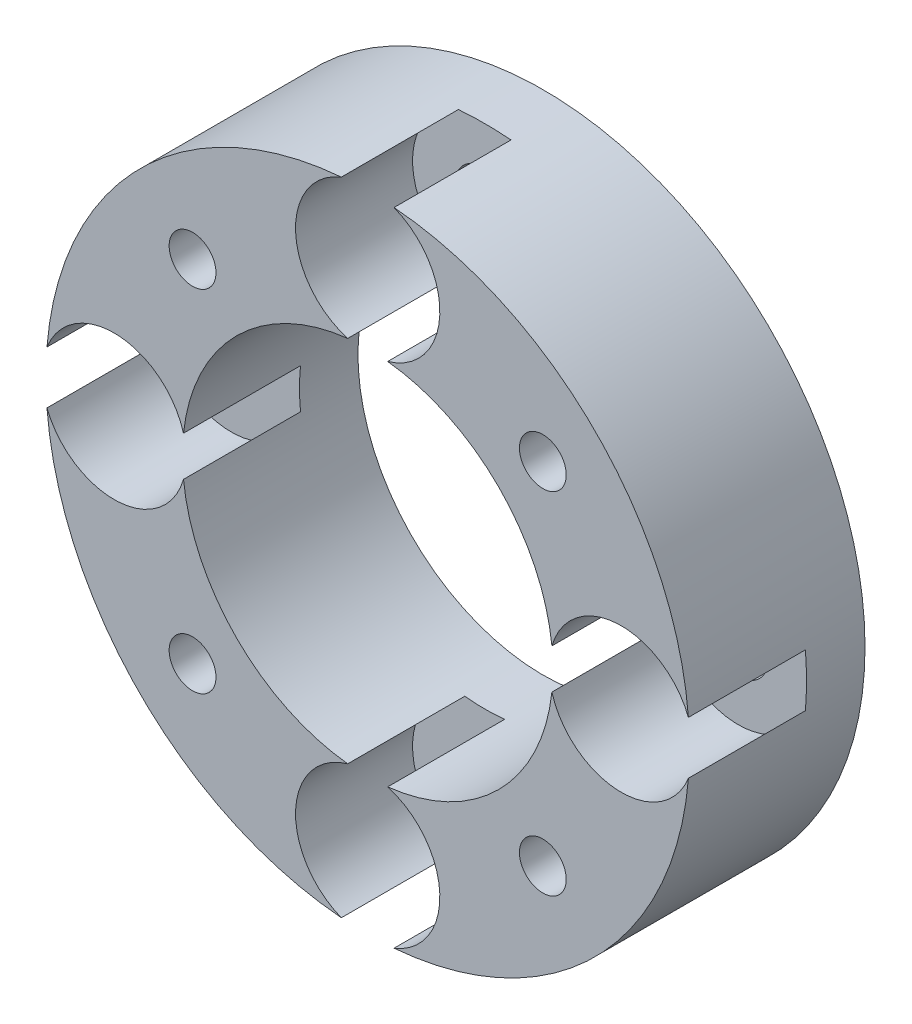
ISO-10303-21;
HEADER;
FILE_DESCRIPTION(('STEP AP214'),'2;1');
FILE_NAME('part.step','',(''),(''),'','','');
FILE_SCHEMA(('AUTOMOTIVE_DESIGN { 1 0 10303 214 1 1 1 1 }'));
ENDSEC;
DATA;
#1=APPLICATION_CONTEXT('core data for automotive mechanical design processes');
#2=APPLICATION_PROTOCOL_DEFINITION('international standard','automotive_design',2000,#1);
#3=PRODUCT_CONTEXT('',#1,'mechanical');
#4=PRODUCT('Part','Part','',(#3));
#5=PRODUCT_RELATED_PRODUCT_CATEGORY('part','',(#4));
#6=PRODUCT_DEFINITION_FORMATION('','',#4);
#7=PRODUCT_DEFINITION_CONTEXT('part definition',#1,'design');
#8=PRODUCT_DEFINITION('design','',#6,#7);
#9=PRODUCT_DEFINITION_SHAPE('','',#8);
#10=(LENGTH_UNIT() NAMED_UNIT(*) SI_UNIT(.MILLI.,.METRE.));
#11=(NAMED_UNIT(*) PLANE_ANGLE_UNIT() SI_UNIT($,.RADIAN.));
#12=(NAMED_UNIT(*) SI_UNIT($,.STERADIAN.) SOLID_ANGLE_UNIT());
#13=UNCERTAINTY_MEASURE_WITH_UNIT(LENGTH_MEASURE(1.E-05),#10,'distance_accuracy_value','');
#14=(GEOMETRIC_REPRESENTATION_CONTEXT(3) GLOBAL_UNCERTAINTY_ASSIGNED_CONTEXT((#13)) GLOBAL_UNIT_ASSIGNED_CONTEXT((#10,
#11,#12)) REPRESENTATION_CONTEXT('',''));
#15=CARTESIAN_POINT('',(0.,0.,0.));
#16=DIRECTION('',(0.,0.,1.));
#17=DIRECTION('',(1.,0.,0.));
#18=AXIS2_PLACEMENT_3D('',#15,#16,#17);
#19=CARTESIAN_POINT('',(0.,0.,9.));
#20=DIRECTION('',(0.,0.,1.));
#21=DIRECTION('',(1.,0.,0.));
#22=AXIS2_PLACEMENT_3D('',#19,#20,#21);
#23=PLANE('',#22);
#24=CARTESIAN_POINT('',(0.,13.,9.));
#25=DIRECTION('',(0.,0.,1.));
#26=DIRECTION('',(1.,0.,0.));
#27=AXIS2_PLACEMENT_3D('',#24,#25,#26);
#28=CIRCLE('',#27,3.7);
#29=CARTESIAN_POINT('',(-1.35078675299656,16.4446153846154,9.));
#30=VERTEX_POINT('',#29);
#31=CARTESIAN_POINT('',(-1.02432428297214,9.44461538461539,9.));
#32=VERTEX_POINT('',#31);
#33=EDGE_CURVE('E233',#30,#32,#28,.T.);
#34=ORIENTED_EDGE('',*,*,#33,.F.);
#35=CARTESIAN_POINT('',(0.,0.,9.));
#36=DIRECTION('',(0.,0.,1.));
#37=DIRECTION('',(1.,0.,0.));
#38=AXIS2_PLACEMENT_3D('',#35,#36,#37);
#39=CIRCLE('',#38,16.5);
#40=CARTESIAN_POINT('',(-16.4446153846155,1.3507867529949,9.));
#41=VERTEX_POINT('',#40);
#42=EDGE_CURVE('E166',#30,#41,#39,.T.);
#43=ORIENTED_EDGE('',*,*,#42,.T.);
#44=CARTESIAN_POINT('',(-12.9999999999996,-3.69482222595252E-13,9.));
#45=DIRECTION('',(0.,0.,1.));
#46=DIRECTION('',(1.,0.,0.));
#47=AXIS2_PLACEMENT_3D('',#44,#45,#46);
#48=CIRCLE('',#47,3.7);
#49=CARTESIAN_POINT('',(-9.44461538461531,1.0243242829728,9.));
#50=VERTEX_POINT('',#49);
#51=EDGE_CURVE('E149',#50,#41,#48,.T.);
#52=ORIENTED_EDGE('',*,*,#51,.F.);
#53=CARTESIAN_POINT('',(0.,0.,9.));
#54=DIRECTION('',(0.,0.,1.));
#55=DIRECTION('',(1.,0.,0.));
#56=AXIS2_PLACEMENT_3D('',#53,#54,#55);
#57=CIRCLE('',#56,9.5);
#58=EDGE_CURVE('E164',#32,#50,#57,.T.);
#59=ORIENTED_EDGE('',*,*,#58,.F.);
#60=EDGE_LOOP('',(#34,#43,#52,#59));
#61=FACE_BOUND('',#60,.T.);
#62=CARTESIAN_POINT('',(-8.98025612106916,8.98025612106865,9.));
#63=DIRECTION('',(0.,0.,1.));
#64=DIRECTION('',(1.,0.,0.));
#65=AXIS2_PLACEMENT_3D('',#62,#63,#64);
#66=CIRCLE('',#65,1.20000000000053);
#67=CARTESIAN_POINT('',(-7.78025612106863,8.98025612106865,9.));
#68=VERTEX_POINT('',#67);
#69=EDGE_CURVE('E277',#68,#68,#66,.T.);
#70=ORIENTED_EDGE('',*,*,#69,.F.);
#71=EDGE_LOOP('',(#70));
#72=FACE_BOUND('',#71,.T.);
#73=ADVANCED_FACE('F34',(#61,#72),#23,.T.);
#74=CARTESIAN_POINT('',(1.02432428297214,9.44461538461539,9.));
#75=VERTEX_POINT('',#74);
#76=CARTESIAN_POINT('',(1.35078675299656,16.4446153846154,9.));
#77=VERTEX_POINT('',#76);
#78=EDGE_CURVE('E399',#75,#77,#28,.T.);
#79=ORIENTED_EDGE('',*,*,#78,.F.);
#80=CARTESIAN_POINT('',(9.44461538461545,1.02432428297149,9.));
#81=VERTEX_POINT('',#80);
#82=EDGE_CURVE('E175',#81,#75,#57,.T.);
#83=ORIENTED_EDGE('',*,*,#82,.F.);
#84=CARTESIAN_POINT('',(13.0000000000004,3.6789018175636E-13,9.));
#85=DIRECTION('',(0.,0.,1.));
#86=DIRECTION('',(1.,0.,0.));
#87=AXIS2_PLACEMENT_3D('',#84,#85,#86);
#88=CIRCLE('',#87,3.7);
#89=CARTESIAN_POINT('',(16.4446153846153,1.35078675299822,9.));
#90=VERTEX_POINT('',#89);
#91=EDGE_CURVE('E397',#90,#81,#88,.T.);
#92=ORIENTED_EDGE('',*,*,#91,.F.);
#93=EDGE_CURVE('E196',#90,#77,#39,.T.);
#94=ORIENTED_EDGE('',*,*,#93,.T.);
#95=EDGE_LOOP('',(#79,#83,#92,#94));
#96=FACE_BOUND('',#95,.T.);
#97=CARTESIAN_POINT('',(8.98025612106914,8.98025612106917,9.));
#98=DIRECTION('',(0.,0.,1.));
#99=DIRECTION('',(1.,0.,0.));
#100=AXIS2_PLACEMENT_3D('',#97,#98,#99);
#101=CIRCLE('',#100,1.2);
#102=CARTESIAN_POINT('',(10.1802561210691,8.98025612106917,9.));
#103=VERTEX_POINT('',#102);
#104=EDGE_CURVE('E190',#103,#103,#101,.T.);
#105=ORIENTED_EDGE('',*,*,#104,.F.);
#106=EDGE_LOOP('',(#105));
#107=FACE_BOUND('',#106,.T.);
#108=ADVANCED_FACE('F310',(#96,#107),#23,.T.);
#109=CARTESIAN_POINT('',(7.35780363512721E-13,-13.,9.));
#110=DIRECTION('',(0.,0.,1.));
#111=DIRECTION('',(1.,0.,0.));
#112=AXIS2_PLACEMENT_3D('',#109,#110,#111);
#113=CIRCLE('',#112,3.7);
#114=CARTESIAN_POINT('',(-1.02432428297161,-9.44461538461544,9.));
#115=VERTEX_POINT('',#114);
#116=CARTESIAN_POINT('',(-1.35078675299563,-16.4446153846155,9.));
#117=VERTEX_POINT('',#116);
#118=EDGE_CURVE('E345',#115,#117,#113,.T.);
#119=ORIENTED_EDGE('',*,*,#118,.F.);
#120=CARTESIAN_POINT('',(-9.44461538461525,-1.02432428297334,9.));
#121=VERTEX_POINT('',#120);
#122=EDGE_CURVE('E176',#121,#115,#57,.T.);
#123=ORIENTED_EDGE('',*,*,#122,.F.);
#124=CARTESIAN_POINT('',(-16.4446153846154,-1.35078675299584,9.));
#125=VERTEX_POINT('',#124);
#126=EDGE_CURVE('E168',#125,#121,#48,.T.);
#127=ORIENTED_EDGE('',*,*,#126,.F.);
#128=EDGE_CURVE('E379',#125,#117,#39,.T.);
#129=ORIENTED_EDGE('',*,*,#128,.T.);
#130=EDGE_LOOP('',(#119,#123,#127,#129));
#131=FACE_BOUND('',#130,.T.);
#132=CARTESIAN_POINT('',(-8.98025612106865,-8.98025612106965,9.));
#133=DIRECTION('',(0.,0.,1.));
#134=DIRECTION('',(1.,0.,0.));
#135=AXIS2_PLACEMENT_3D('',#132,#133,#134);
#136=CIRCLE('',#135,1.20000000000036);
#137=CARTESIAN_POINT('',(-7.78025612106829,-8.98025612106965,9.));
#138=VERTEX_POINT('',#137);
#139=EDGE_CURVE('E283',#138,#138,#136,.T.);
#140=ORIENTED_EDGE('',*,*,#139,.F.);
#141=EDGE_LOOP('',(#140));
#142=FACE_BOUND('',#141,.T.);
#143=ADVANCED_FACE('F316',(#131,#142),#23,.T.);
#144=CARTESIAN_POINT('',(0.,13.,9.));
#145=DIRECTION('',(0.,0.,-1.));
#146=DIRECTION('',(-1.,0.,0.));
#147=AXIS2_PLACEMENT_3D('',#144,#145,#146);
#148=CYLINDRICAL_SURFACE('',#147,1.55);
#149=CARTESIAN_POINT('',(0.,13.,0.));
#150=DIRECTION('',(0.,0.,1.));
#151=DIRECTION('',(1.,0.,0.));
#152=AXIS2_PLACEMENT_3D('',#149,#150,#151);
#153=CIRCLE('',#152,1.55);
#154=CARTESIAN_POINT('',(1.55,13.,0.));
#155=VERTEX_POINT('',#154);
#156=EDGE_CURVE('E273',#155,#155,#153,.T.);
#157=ORIENTED_EDGE('',*,*,#156,.F.);
#158=EDGE_LOOP('',(#157));
#159=FACE_BOUND('',#158,.T.);
#160=CARTESIAN_POINT('',(0.,13.,3.));
#161=DIRECTION('',(0.,0.,1.));
#162=DIRECTION('',(1.,0.,0.));
#163=AXIS2_PLACEMENT_3D('',#160,#161,#162);
#164=CIRCLE('',#163,1.55);
#165=CARTESIAN_POINT('',(1.55,13.,3.));
#166=VERTEX_POINT('',#165);
#167=EDGE_CURVE('E216',#166,#166,#164,.T.);
#168=ORIENTED_EDGE('',*,*,#167,.T.);
#169=EDGE_LOOP('',(#168));
#170=FACE_BOUND('',#169,.T.);
#171=ADVANCED_FACE('F333',(#159,#170),#148,.F.);
#172=CARTESIAN_POINT('',(13.0000000000003,3.39652169345829E-13,9.));
#173=DIRECTION('',(0.,0.,-1.));
#174=DIRECTION('',(-1.,0.,0.));
#175=AXIS2_PLACEMENT_3D('',#172,#173,#174);
#176=CYLINDRICAL_SURFACE('',#175,1.55);
#177=CARTESIAN_POINT('',(13.0000000000003,3.39652169345829E-13,0.));
#178=DIRECTION('',(0.,0.,1.));
#179=DIRECTION('',(1.,0.,0.));
#180=AXIS2_PLACEMENT_3D('',#177,#178,#179);
#181=CIRCLE('',#180,1.55);
#182=CARTESIAN_POINT('',(14.5500000000003,3.39652169345829E-13,0.));
#183=VERTEX_POINT('',#182);
#184=EDGE_CURVE('E270',#183,#183,#181,.T.);
#185=ORIENTED_EDGE('',*,*,#184,.F.);
#186=EDGE_LOOP('',(#185));
#187=FACE_BOUND('',#186,.T.);
#188=CARTESIAN_POINT('',(13.0000000000003,3.39652169345829E-13,3.));
#189=DIRECTION('',(0.,0.,1.));
#190=DIRECTION('',(1.,0.,0.));
#191=AXIS2_PLACEMENT_3D('',#188,#189,#190);
#192=CIRCLE('',#191,1.55);
#193=CARTESIAN_POINT('',(14.5500000000003,3.39652169345829E-13,3.));
#194=VERTEX_POINT('',#193);
#195=EDGE_CURVE('E211',#194,#194,#192,.T.);
#196=ORIENTED_EDGE('',*,*,#195,.T.);
#197=EDGE_LOOP('',(#196));
#198=FACE_BOUND('',#197,.T.);
#199=ADVANCED_FACE('F338',(#187,#198),#176,.F.);
#200=CARTESIAN_POINT('',(6.79304338691657E-13,-13.,9.));
#201=DIRECTION('',(0.,0.,-1.));
#202=DIRECTION('',(-1.,0.,0.));
#203=AXIS2_PLACEMENT_3D('',#200,#201,#202);
#204=CYLINDRICAL_SURFACE('',#203,1.55);
#205=CARTESIAN_POINT('',(6.79304338691657E-13,-13.,0.));
#206=DIRECTION('',(0.,0.,1.));
#207=DIRECTION('',(1.,0.,0.));
#208=AXIS2_PLACEMENT_3D('',#205,#206,#207);
#209=CIRCLE('',#208,1.55);
#210=CARTESIAN_POINT('',(1.55000000000068,-13.,0.));
#211=VERTEX_POINT('',#210);
#212=EDGE_CURVE('E267',#211,#211,#209,.T.);
#213=ORIENTED_EDGE('',*,*,#212,.F.);
#214=EDGE_LOOP('',(#213));
#215=FACE_BOUND('',#214,.T.);
#216=CARTESIAN_POINT('',(6.79304338691657E-13,-13.,3.));
#217=DIRECTION('',(0.,0.,1.));
#218=DIRECTION('',(1.,0.,0.));
#219=AXIS2_PLACEMENT_3D('',#216,#217,#218);
#220=CIRCLE('',#219,1.55);
#221=CARTESIAN_POINT('',(1.55000000000068,-13.,3.));
#222=VERTEX_POINT('',#221);
#223=EDGE_CURVE('E206',#222,#222,#220,.T.);
#224=ORIENTED_EDGE('',*,*,#223,.T.);
#225=EDGE_LOOP('',(#224));
#226=FACE_BOUND('',#225,.T.);
#227=ADVANCED_FACE('F327',(#215,#226),#204,.F.);
#228=CARTESIAN_POINT('',(-12.9999999999997,-3.4124421018472E-13,9.));
#229=DIRECTION('',(0.,0.,-1.));
#230=DIRECTION('',(-1.,0.,0.));
#231=AXIS2_PLACEMENT_3D('',#228,#229,#230);
#232=CYLINDRICAL_SURFACE('',#231,1.55);
#233=CARTESIAN_POINT('',(-12.9999999999997,-3.4124421018472E-13,0.));
#234=DIRECTION('',(0.,0.,1.));
#235=DIRECTION('',(1.,0.,0.));
#236=AXIS2_PLACEMENT_3D('',#233,#234,#235);
#237=CIRCLE('',#236,1.55);
#238=CARTESIAN_POINT('',(-11.4499999999997,-3.4124421018472E-13,0.));
#239=VERTEX_POINT('',#238);
#240=EDGE_CURVE('E264',#239,#239,#237,.T.);
#241=ORIENTED_EDGE('',*,*,#240,.F.);
#242=EDGE_LOOP('',(#241));
#243=FACE_BOUND('',#242,.T.);
#244=CARTESIAN_POINT('',(-12.9999999999997,-3.4124421018472E-13,3.));
#245=DIRECTION('',(0.,0.,1.));
#246=DIRECTION('',(1.,0.,0.));
#247=AXIS2_PLACEMENT_3D('',#244,#245,#246);
#248=CIRCLE('',#247,1.55);
#249=CARTESIAN_POINT('',(-11.4499999999997,-3.4124421018472E-13,3.));
#250=VERTEX_POINT('',#249);
#251=EDGE_CURVE('E202',#250,#250,#248,.T.);
#252=ORIENTED_EDGE('',*,*,#251,.T.);
#253=EDGE_LOOP('',(#252));
#254=FACE_BOUND('',#253,.T.);
#255=ADVANCED_FACE('F320',(#243,#254),#232,.F.);
#256=CARTESIAN_POINT('',(9.44461538461551,-1.02432428297096,9.));
#257=VERTEX_POINT('',#256);
#258=CARTESIAN_POINT('',(16.4446153846153,-1.35078675299729,9.));
#259=VERTEX_POINT('',#258);
#260=EDGE_CURVE('E385',#257,#259,#88,.T.);
#261=ORIENTED_EDGE('',*,*,#260,.F.);
#262=CARTESIAN_POINT('',(1.02432428297268,-9.44461538461533,9.));
#263=VERTEX_POINT('',#262);
#264=EDGE_CURVE('E180',#263,#257,#57,.T.);
#265=ORIENTED_EDGE('',*,*,#264,.F.);
#266=CARTESIAN_POINT('',(1.35078675299749,-16.4446153846153,9.));
#267=VERTEX_POINT('',#266);
#268=EDGE_CURVE('E387',#267,#263,#113,.T.);
#269=ORIENTED_EDGE('',*,*,#268,.F.);
#270=EDGE_CURVE('E199',#267,#259,#39,.T.);
#271=ORIENTED_EDGE('',*,*,#270,.T.);
#272=EDGE_LOOP('',(#261,#265,#269,#271));
#273=FACE_BOUND('',#272,.T.);
#274=CARTESIAN_POINT('',(8.98025612106965,-8.98025612106916,9.));
#275=DIRECTION('',(0.,0.,1.));
#276=DIRECTION('',(1.,0.,0.));
#277=AXIS2_PLACEMENT_3D('',#274,#275,#276);
#278=CIRCLE('',#277,1.19999999999986);
#279=CARTESIAN_POINT('',(10.1802561210695,-8.98025612106916,9.));
#280=VERTEX_POINT('',#279);
#281=EDGE_CURVE('E189',#280,#280,#278,.T.);
#282=ORIENTED_EDGE('',*,*,#281,.F.);
#283=EDGE_LOOP('',(#282));
#284=FACE_BOUND('',#283,.T.);
#285=ADVANCED_FACE('F312',(#273,#284),#23,.T.);
#286=CARTESIAN_POINT('',(0.,0.,0.));
#287=DIRECTION('',(0.,0.,1.));
#288=DIRECTION('',(1.,0.,0.));
#289=AXIS2_PLACEMENT_3D('',#286,#287,#288);
#290=PLANE('',#289);
#291=CARTESIAN_POINT('',(0.,0.,0.));
#292=DIRECTION('',(0.,0.,1.));
#293=DIRECTION('',(1.,0.,0.));
#294=AXIS2_PLACEMENT_3D('',#291,#292,#293);
#295=CIRCLE('',#294,16.5);
#296=CARTESIAN_POINT('',(16.5,0.,0.));
#297=VERTEX_POINT('',#296);
#298=EDGE_CURVE('E193',#297,#297,#295,.T.);
#299=ORIENTED_EDGE('',*,*,#298,.F.);
#300=EDGE_LOOP('',(#299));
#301=FACE_BOUND('',#300,.T.);
#302=CARTESIAN_POINT('',(8.98025612106914,8.98025612106917,0.));
#303=DIRECTION('',(0.,0.,1.));
#304=DIRECTION('',(1.,0.,0.));
#305=AXIS2_PLACEMENT_3D('',#302,#303,#304);
#306=CIRCLE('',#305,1.2);
#307=CARTESIAN_POINT('',(10.1802561210691,8.98025612106917,0.));
#308=VERTEX_POINT('',#307);
#309=EDGE_CURVE('E179',#308,#308,#306,.T.);
#310=ORIENTED_EDGE('',*,*,#309,.T.);
#311=EDGE_LOOP('',(#310));
#312=FACE_BOUND('',#311,.T.);
#313=CARTESIAN_POINT('',(0.,0.,0.));
#314=DIRECTION('',(0.,0.,1.));
#315=DIRECTION('',(1.,0.,0.));
#316=AXIS2_PLACEMENT_3D('',#313,#314,#315);
#317=CIRCLE('',#316,9.5);
#318=CARTESIAN_POINT('',(9.5,0.,0.));
#319=VERTEX_POINT('',#318);
#320=EDGE_CURVE('E186',#319,#319,#317,.T.);
#321=ORIENTED_EDGE('',*,*,#320,.T.);
#322=EDGE_LOOP('',(#321));
#323=FACE_BOUND('',#322,.T.);
#324=CARTESIAN_POINT('',(8.98025612106965,-8.98025612106916,0.));
#325=DIRECTION('',(0.,0.,1.));
#326=DIRECTION('',(1.,0.,0.));
#327=AXIS2_PLACEMENT_3D('',#324,#325,#326);
#328=CIRCLE('',#327,1.19999999999986);
#329=CARTESIAN_POINT('',(10.1802561210695,-8.98025612106916,0.));
#330=VERTEX_POINT('',#329);
#331=EDGE_CURVE('E184',#330,#330,#328,.T.);
#332=ORIENTED_EDGE('',*,*,#331,.T.);
#333=EDGE_LOOP('',(#332));
#334=FACE_BOUND('',#333,.T.);
#335=CARTESIAN_POINT('',(-8.98025612106865,-8.98025612106965,0.));
#336=DIRECTION('',(0.,0.,1.));
#337=DIRECTION('',(1.,0.,0.));
#338=AXIS2_PLACEMENT_3D('',#335,#336,#337);
#339=CIRCLE('',#338,1.20000000000036);
#340=CARTESIAN_POINT('',(-7.78025612106829,-8.98025612106965,0.));
#341=VERTEX_POINT('',#340);
#342=EDGE_CURVE('E280',#341,#341,#339,.T.);
#343=ORIENTED_EDGE('',*,*,#342,.T.);
#344=EDGE_LOOP('',(#343));
#345=FACE_BOUND('',#344,.T.);
#346=CARTESIAN_POINT('',(-8.98025612106916,8.98025612106865,0.));
#347=DIRECTION('',(0.,0.,1.));
#348=DIRECTION('',(1.,0.,0.));
#349=AXIS2_PLACEMENT_3D('',#346,#347,#348);
#350=CIRCLE('',#349,1.20000000000053);
#351=CARTESIAN_POINT('',(-7.78025612106863,8.98025612106865,0.));
#352=VERTEX_POINT('',#351);
#353=EDGE_CURVE('E276',#352,#352,#350,.T.);
#354=ORIENTED_EDGE('',*,*,#353,.T.);
#355=EDGE_LOOP('',(#354));
#356=FACE_BOUND('',#355,.T.);
#357=ORIENTED_EDGE('',*,*,#156,.T.);
#358=EDGE_LOOP('',(#357));
#359=FACE_BOUND('',#358,.T.);
#360=ORIENTED_EDGE('',*,*,#184,.T.);
#361=EDGE_LOOP('',(#360));
#362=FACE_BOUND('',#361,.T.);
#363=ORIENTED_EDGE('',*,*,#212,.T.);
#364=EDGE_LOOP('',(#363));
#365=FACE_BOUND('',#364,.T.);
#366=ORIENTED_EDGE('',*,*,#240,.T.);
#367=EDGE_LOOP('',(#366));
#368=FACE_BOUND('',#367,.T.);
#369=ADVANCED_FACE('F293',(#301,#312,#323,#334,#345,#356,#359,#362,#365,#368),#290,.F.);
#370=CARTESIAN_POINT('',(0.,0.,9.));
#371=DIRECTION('',(0.,0.,-1.));
#372=DIRECTION('',(-1.,0.,0.));
#373=AXIS2_PLACEMENT_3D('',#370,#371,#372);
#374=CYLINDRICAL_SURFACE('',#373,16.5);
#375=CARTESIAN_POINT('',(0.,0.,3.));
#376=DIRECTION('',(0.,0.,1.));
#377=DIRECTION('',(1.,0.,0.));
#378=AXIS2_PLACEMENT_3D('',#375,#376,#377);
#379=CIRCLE('',#378,16.5);
#380=CARTESIAN_POINT('',(1.35078675299656,16.4446153846154,3.));
#381=VERTEX_POINT('',#380);
#382=CARTESIAN_POINT('',(-1.35078675299656,16.4446153846154,3.));
#383=VERTEX_POINT('',#382);
#384=EDGE_CURVE('E236',#381,#383,#379,.T.);
#385=ORIENTED_EDGE('',*,*,#384,.F.);
#386=DIRECTION('',(0.,0.,1.));
#387=VECTOR('',#386,1.);
#388=CARTESIAN_POINT('',(1.35078675299655,16.4446153846154,6.));
#389=LINE('',#388,#387);
#390=EDGE_CURVE('E261',#381,#77,#389,.T.);
#391=ORIENTED_EDGE('',*,*,#390,.T.);
#392=ORIENTED_EDGE('',*,*,#93,.F.);
#393=DIRECTION('',(0.,0.,1.));
#394=VECTOR('',#393,1.);
#395=CARTESIAN_POINT('',(16.4446153846152,1.35078675299823,6.));
#396=LINE('',#395,#394);
#397=CARTESIAN_POINT('',(16.4446153846153,1.35078675299822,3.));
#398=VERTEX_POINT('',#397);
#399=EDGE_CURVE('E253',#90,#398,#396,.F.);
#400=ORIENTED_EDGE('',*,*,#399,.T.);
#401=CARTESIAN_POINT('',(0.,0.,3.));
#402=DIRECTION('',(0.,0.,1.));
#403=DIRECTION('',(1.,0.,0.));
#404=AXIS2_PLACEMENT_3D('',#401,#402,#403);
#405=CIRCLE('',#404,16.5);
#406=CARTESIAN_POINT('',(16.4446153846153,-1.35078675299729,3.));
#407=VERTEX_POINT('',#406);
#408=EDGE_CURVE('E220',#407,#398,#405,.T.);
#409=ORIENTED_EDGE('',*,*,#408,.F.);
#410=DIRECTION('',(0.,0.,1.));
#411=VECTOR('',#410,1.);
#412=CARTESIAN_POINT('',(16.4446153846153,-1.3507867529973,6.));
#413=LINE('',#412,#411);
#414=EDGE_CURVE('E256',#407,#259,#413,.T.);
#415=ORIENTED_EDGE('',*,*,#414,.T.);
#416=ORIENTED_EDGE('',*,*,#270,.F.);
#417=DIRECTION('',(0.,0.,1.));
#418=VECTOR('',#417,1.);
#419=CARTESIAN_POINT('',(1.35078675299748,-16.4446153846153,6.));
#420=LINE('',#419,#418);
#421=CARTESIAN_POINT('',(1.35078675299749,-16.4446153846153,3.));
#422=VERTEX_POINT('',#421);
#423=EDGE_CURVE('E247',#267,#422,#420,.F.);
#424=ORIENTED_EDGE('',*,*,#423,.T.);
#425=CARTESIAN_POINT('',(0.,0.,3.));
#426=DIRECTION('',(0.,0.,1.));
#427=DIRECTION('',(1.,0.,0.));
#428=AXIS2_PLACEMENT_3D('',#425,#426,#427);
#429=CIRCLE('',#428,16.5);
#430=CARTESIAN_POINT('',(-1.35078675299563,-16.4446153846155,3.));
#431=VERTEX_POINT('',#430);
#432=EDGE_CURVE('E215',#431,#422,#429,.T.);
#433=ORIENTED_EDGE('',*,*,#432,.F.);
#434=DIRECTION('',(0.,0.,1.));
#435=VECTOR('',#434,1.);
#436=CARTESIAN_POINT('',(-1.35078675299562,-16.4446153846155,6.));
#437=LINE('',#436,#435);
#438=EDGE_CURVE('E250',#431,#117,#437,.T.);
#439=ORIENTED_EDGE('',*,*,#438,.T.);
#440=ORIENTED_EDGE('',*,*,#128,.F.);
#441=DIRECTION('',(0.,0.,1.));
#442=VECTOR('',#441,1.);
#443=CARTESIAN_POINT('',(-16.4446153846154,-1.35078675299583,6.));
#444=LINE('',#443,#442);
#445=CARTESIAN_POINT('',(-16.4446153846154,-1.35078675299584,3.));
#446=VERTEX_POINT('',#445);
#447=EDGE_CURVE('E238',#125,#446,#444,.F.);
#448=ORIENTED_EDGE('',*,*,#447,.T.);
#449=CARTESIAN_POINT('',(0.,0.,3.));
#450=DIRECTION('',(0.,0.,1.));
#451=DIRECTION('',(1.,0.,0.));
#452=AXIS2_PLACEMENT_3D('',#449,#450,#451);
#453=CIRCLE('',#452,16.5);
#454=CARTESIAN_POINT('',(-16.4446153846155,1.3507867529949,3.));
#455=VERTEX_POINT('',#454);
#456=EDGE_CURVE('E210',#455,#446,#453,.T.);
#457=ORIENTED_EDGE('',*,*,#456,.F.);
#458=DIRECTION('',(0.,0.,1.));
#459=VECTOR('',#458,1.);
#460=CARTESIAN_POINT('',(-16.4446153846155,1.3507867529949,6.));
#461=LINE('',#460,#459);
#462=EDGE_CURVE('E245',#455,#41,#461,.T.);
#463=ORIENTED_EDGE('',*,*,#462,.T.);
#464=ORIENTED_EDGE('',*,*,#42,.F.);
#465=DIRECTION('',(0.,0.,1.));
#466=VECTOR('',#465,1.);
#467=CARTESIAN_POINT('',(-1.35078675299655,16.4446153846154,6.));
#468=LINE('',#467,#466);
#469=EDGE_CURVE('E259',#30,#383,#468,.F.);
#470=ORIENTED_EDGE('',*,*,#469,.T.);
#471=EDGE_LOOP('',(#385,#391,#392,#400,#409,#415,#416,#424,#433,#439,#440,#448,#457,#463,#464,#470));
#472=FACE_BOUND('',#471,.T.);
#473=ORIENTED_EDGE('',*,*,#298,.T.);
#474=EDGE_LOOP('',(#473));
#475=FACE_BOUND('',#474,.T.);
#476=ADVANCED_FACE('F36',(#472,#475),#374,.T.);
#477=CARTESIAN_POINT('',(8.98025612106914,8.98025612106917,9.));
#478=DIRECTION('',(0.,0.,-1.));
#479=DIRECTION('',(-1.,0.,0.));
#480=AXIS2_PLACEMENT_3D('',#477,#478,#479);
#481=CYLINDRICAL_SURFACE('',#480,1.2);
#482=ORIENTED_EDGE('',*,*,#104,.T.);
#483=EDGE_LOOP('',(#482));
#484=FACE_BOUND('',#483,.T.);
#485=ORIENTED_EDGE('',*,*,#309,.F.);
#486=EDGE_LOOP('',(#485));
#487=FACE_BOUND('',#486,.T.);
#488=ADVANCED_FACE('F307',(#484,#487),#481,.F.);
#489=CARTESIAN_POINT('',(0.,0.,9.));
#490=DIRECTION('',(0.,0.,-1.));
#491=DIRECTION('',(-1.,0.,0.));
#492=AXIS2_PLACEMENT_3D('',#489,#490,#491);
#493=CYLINDRICAL_SURFACE('',#492,9.5);
#494=DIRECTION('',(0.,0.,1.));
#495=VECTOR('',#494,1.);
#496=CARTESIAN_POINT('',(1.02432428297214,9.44461538461539,6.));
#497=LINE('',#496,#495);
#498=CARTESIAN_POINT('',(1.02432428297214,9.44461538461539,3.));
#499=VERTEX_POINT('',#498);
#500=EDGE_CURVE('E11',#499,#75,#497,.T.);
#501=ORIENTED_EDGE('',*,*,#500,.F.);
#502=CARTESIAN_POINT('',(0.,0.,3.));
#503=DIRECTION('',(0.,0.,1.));
#504=DIRECTION('',(1.,0.,0.));
#505=AXIS2_PLACEMENT_3D('',#502,#503,#504);
#506=CIRCLE('',#505,9.5);
#507=CARTESIAN_POINT('',(-1.02432428297214,9.44461538461539,3.));
#508=VERTEX_POINT('',#507);
#509=EDGE_CURVE('E219',#499,#508,#506,.T.);
#510=ORIENTED_EDGE('',*,*,#509,.T.);
#511=DIRECTION('',(0.,0.,1.));
#512=VECTOR('',#511,1.);
#513=CARTESIAN_POINT('',(-1.02432428297214,9.44461538461539,6.));
#514=LINE('',#513,#512);
#515=EDGE_CURVE('E42',#32,#508,#514,.F.);
#516=ORIENTED_EDGE('',*,*,#515,.F.);
#517=ORIENTED_EDGE('',*,*,#58,.T.);
#518=DIRECTION('',(0.,0.,1.));
#519=VECTOR('',#518,1.);
#520=CARTESIAN_POINT('',(-9.44461538461531,1.0243242829728,6.));
#521=LINE('',#520,#519);
#522=CARTESIAN_POINT('',(-9.44461538461531,1.0243242829728,3.));
#523=VERTEX_POINT('',#522);
#524=EDGE_CURVE('E146',#523,#50,#521,.T.);
#525=ORIENTED_EDGE('',*,*,#524,.F.);
#526=CARTESIAN_POINT('',(0.,0.,3.));
#527=DIRECTION('',(0.,0.,1.));
#528=DIRECTION('',(1.,0.,0.));
#529=AXIS2_PLACEMENT_3D('',#526,#527,#528);
#530=CIRCLE('',#529,9.5);
#531=CARTESIAN_POINT('',(-9.44461538461525,-1.02432428297334,3.));
#532=VERTEX_POINT('',#531);
#533=EDGE_CURVE('E205',#523,#532,#530,.T.);
#534=ORIENTED_EDGE('',*,*,#533,.T.);
#535=DIRECTION('',(0.,0.,1.));
#536=VECTOR('',#535,1.);
#537=CARTESIAN_POINT('',(-9.44461538461525,-1.02432428297334,6.));
#538=LINE('',#537,#536);
#539=EDGE_CURVE('E157',#121,#532,#538,.F.);
#540=ORIENTED_EDGE('',*,*,#539,.F.);
#541=ORIENTED_EDGE('',*,*,#122,.T.);
#542=DIRECTION('',(0.,0.,1.));
#543=VECTOR('',#542,1.);
#544=CARTESIAN_POINT('',(-1.02432428297161,-9.44461538461544,6.));
#545=LINE('',#544,#543);
#546=CARTESIAN_POINT('',(-1.02432428297161,-9.44461538461544,3.));
#547=VERTEX_POINT('',#546);
#548=EDGE_CURVE('E225',#547,#115,#545,.T.);
#549=ORIENTED_EDGE('',*,*,#548,.F.);
#550=CARTESIAN_POINT('',(0.,0.,3.));
#551=DIRECTION('',(0.,0.,1.));
#552=DIRECTION('',(1.,0.,0.));
#553=AXIS2_PLACEMENT_3D('',#550,#551,#552);
#554=CIRCLE('',#553,9.5);
#555=CARTESIAN_POINT('',(1.02432428297268,-9.44461538461533,3.));
#556=VERTEX_POINT('',#555);
#557=EDGE_CURVE('E209',#547,#556,#554,.T.);
#558=ORIENTED_EDGE('',*,*,#557,.T.);
#559=DIRECTION('',(0.,0.,1.));
#560=VECTOR('',#559,1.);
#561=CARTESIAN_POINT('',(1.02432428297267,-9.44461538461533,6.));
#562=LINE('',#561,#560);
#563=EDGE_CURVE('E156',#263,#556,#562,.F.);
#564=ORIENTED_EDGE('',*,*,#563,.F.);
#565=ORIENTED_EDGE('',*,*,#264,.T.);
#566=DIRECTION('',(0.,0.,1.));
#567=VECTOR('',#566,1.);
#568=CARTESIAN_POINT('',(9.44461538461551,-1.02432428297096,6.));
#569=LINE('',#568,#567);
#570=CARTESIAN_POINT('',(9.44461538461551,-1.02432428297096,3.));
#571=VERTEX_POINT('',#570);
#572=EDGE_CURVE('E229',#571,#257,#569,.T.);
#573=ORIENTED_EDGE('',*,*,#572,.F.);
#574=CARTESIAN_POINT('',(0.,0.,3.));
#575=DIRECTION('',(0.,0.,1.));
#576=DIRECTION('',(1.,0.,0.));
#577=AXIS2_PLACEMENT_3D('',#574,#575,#576);
#578=CIRCLE('',#577,9.5);
#579=CARTESIAN_POINT('',(9.44461538461545,1.02432428297149,3.));
#580=VERTEX_POINT('',#579);
#581=EDGE_CURVE('E214',#571,#580,#578,.T.);
#582=ORIENTED_EDGE('',*,*,#581,.T.);
#583=DIRECTION('',(0.,0.,1.));
#584=VECTOR('',#583,1.);
#585=CARTESIAN_POINT('',(9.44461538461545,1.02432428297149,6.));
#586=LINE('',#585,#584);
#587=EDGE_CURVE('E227',#81,#580,#586,.F.);
#588=ORIENTED_EDGE('',*,*,#587,.F.);
#589=ORIENTED_EDGE('',*,*,#82,.T.);
#590=EDGE_LOOP('',(#501,#510,#516,#517,#525,#534,#540,#541,#549,#558,#564,#565,#573,#582,#588,#589));
#591=FACE_BOUND('',#590,.T.);
#592=ORIENTED_EDGE('',*,*,#320,.F.);
#593=EDGE_LOOP('',(#592));
#594=FACE_BOUND('',#593,.T.);
#595=ADVANCED_FACE('F172',(#591,#594),#493,.F.);
#596=CARTESIAN_POINT('',(8.98025612106965,-8.98025612106916,9.));
#597=DIRECTION('',(0.,0.,-1.));
#598=DIRECTION('',(-1.,0.,0.));
#599=AXIS2_PLACEMENT_3D('',#596,#597,#598);
#600=CYLINDRICAL_SURFACE('',#599,1.19999999999986);
#601=ORIENTED_EDGE('',*,*,#281,.T.);
#602=EDGE_LOOP('',(#601));
#603=FACE_BOUND('',#602,.T.);
#604=ORIENTED_EDGE('',*,*,#331,.F.);
#605=EDGE_LOOP('',(#604));
#606=FACE_BOUND('',#605,.T.);
#607=ADVANCED_FACE('F296',(#603,#606),#600,.F.);
#608=CARTESIAN_POINT('',(-8.98025612106865,-8.98025612106965,9.));
#609=DIRECTION('',(0.,0.,-1.));
#610=DIRECTION('',(-1.,0.,0.));
#611=AXIS2_PLACEMENT_3D('',#608,#609,#610);
#612=CYLINDRICAL_SURFACE('',#611,1.20000000000036);
#613=ORIENTED_EDGE('',*,*,#139,.T.);
#614=EDGE_LOOP('',(#613));
#615=FACE_BOUND('',#614,.T.);
#616=ORIENTED_EDGE('',*,*,#342,.F.);
#617=EDGE_LOOP('',(#616));
#618=FACE_BOUND('',#617,.T.);
#619=ADVANCED_FACE('F298',(#615,#618),#612,.F.);
#620=CARTESIAN_POINT('',(-8.98025612106916,8.98025612106865,9.));
#621=DIRECTION('',(0.,0.,-1.));
#622=DIRECTION('',(-1.,0.,0.));
#623=AXIS2_PLACEMENT_3D('',#620,#621,#622);
#624=CYLINDRICAL_SURFACE('',#623,1.20000000000053);
#625=ORIENTED_EDGE('',*,*,#69,.T.);
#626=EDGE_LOOP('',(#625));
#627=FACE_BOUND('',#626,.T.);
#628=ORIENTED_EDGE('',*,*,#353,.F.);
#629=EDGE_LOOP('',(#628));
#630=FACE_BOUND('',#629,.T.);
#631=ADVANCED_FACE('F304',(#627,#630),#624,.F.);
#632=CARTESIAN_POINT('',(-12.9999999999996,-3.69482222595252E-13,3.));
#633=DIRECTION('',(0.,0.,1.));
#634=DIRECTION('',(1.,0.,0.));
#635=AXIS2_PLACEMENT_3D('',#632,#633,#634);
#636=CYLINDRICAL_SURFACE('',#635,3.7);
#637=CARTESIAN_POINT('',(-12.9999999999996,-3.69482222595252E-13,3.));
#638=DIRECTION('',(0.,0.,1.));
#639=DIRECTION('',(1.,0.,0.));
#640=AXIS2_PLACEMENT_3D('',#637,#638,#639);
#641=CIRCLE('',#640,3.7);
#642=EDGE_CURVE('E152',#523,#455,#641,.T.);
#643=ORIENTED_EDGE('',*,*,#642,.F.);
#644=ORIENTED_EDGE('',*,*,#524,.T.);
#645=ORIENTED_EDGE('',*,*,#51,.T.);
#646=ORIENTED_EDGE('',*,*,#462,.F.);
#647=EDGE_LOOP('',(#643,#644,#645,#646));
#648=FACE_BOUND('',#647,.T.);
#649=ADVANCED_FACE('F148',(#648),#636,.F.);
#650=ORIENTED_EDGE('',*,*,#126,.T.);
#651=ORIENTED_EDGE('',*,*,#539,.T.);
#652=EDGE_CURVE('E167',#446,#532,#641,.T.);
#653=ORIENTED_EDGE('',*,*,#652,.F.);
#654=ORIENTED_EDGE('',*,*,#447,.F.);
#655=EDGE_LOOP('',(#650,#651,#653,#654));
#656=FACE_BOUND('',#655,.T.);
#657=ADVANCED_FACE('F366',(#656),#636,.F.);
#658=CARTESIAN_POINT('',(-12.9999999999996,-3.69482222595252E-13,3.));
#659=DIRECTION('',(0.,0.,1.));
#660=DIRECTION('',(1.,0.,0.));
#661=AXIS2_PLACEMENT_3D('',#658,#659,#660);
#662=PLANE('',#661);
#663=ORIENTED_EDGE('',*,*,#251,.F.);
#664=EDGE_LOOP('',(#663));
#665=FACE_BOUND('',#664,.T.);
#666=ORIENTED_EDGE('',*,*,#456,.T.);
#667=ORIENTED_EDGE('',*,*,#652,.T.);
#668=ORIENTED_EDGE('',*,*,#533,.F.);
#669=ORIENTED_EDGE('',*,*,#642,.T.);
#670=EDGE_LOOP('',(#666,#667,#668,#669));
#671=FACE_BOUND('',#670,.T.);
#672=ADVANCED_FACE('F362',(#665,#671),#662,.T.);
#673=CARTESIAN_POINT('',(7.35780363512721E-13,-13.,3.));
#674=DIRECTION('',(0.,0.,1.));
#675=DIRECTION('',(1.,0.,0.));
#676=AXIS2_PLACEMENT_3D('',#673,#674,#675);
#677=CYLINDRICAL_SURFACE('',#676,3.7);
#678=CARTESIAN_POINT('',(7.35780363512721E-13,-13.,3.));
#679=DIRECTION('',(0.,0.,1.));
#680=DIRECTION('',(1.,0.,0.));
#681=AXIS2_PLACEMENT_3D('',#678,#679,#680);
#682=CIRCLE('',#681,3.7);
#683=EDGE_CURVE('E406',#547,#431,#682,.T.);
#684=ORIENTED_EDGE('',*,*,#683,.F.);
#685=ORIENTED_EDGE('',*,*,#548,.T.);
#686=ORIENTED_EDGE('',*,*,#118,.T.);
#687=ORIENTED_EDGE('',*,*,#438,.F.);
#688=EDGE_LOOP('',(#684,#685,#686,#687));
#689=FACE_BOUND('',#688,.T.);
#690=ADVANCED_FACE('F365',(#689),#677,.F.);
#691=ORIENTED_EDGE('',*,*,#268,.T.);
#692=ORIENTED_EDGE('',*,*,#563,.T.);
#693=EDGE_CURVE('E404',#422,#556,#682,.T.);
#694=ORIENTED_EDGE('',*,*,#693,.F.);
#695=ORIENTED_EDGE('',*,*,#423,.F.);
#696=EDGE_LOOP('',(#691,#692,#694,#695));
#697=FACE_BOUND('',#696,.T.);
#698=ADVANCED_FACE('F417',(#697),#677,.F.);
#699=CARTESIAN_POINT('',(7.35780363512721E-13,-13.,3.));
#700=DIRECTION('',(0.,0.,1.));
#701=DIRECTION('',(1.,0.,0.));
#702=AXIS2_PLACEMENT_3D('',#699,#700,#701);
#703=PLANE('',#702);
#704=ORIENTED_EDGE('',*,*,#223,.F.);
#705=EDGE_LOOP('',(#704));
#706=FACE_BOUND('',#705,.T.);
#707=ORIENTED_EDGE('',*,*,#432,.T.);
#708=ORIENTED_EDGE('',*,*,#693,.T.);
#709=ORIENTED_EDGE('',*,*,#557,.F.);
#710=ORIENTED_EDGE('',*,*,#683,.T.);
#711=EDGE_LOOP('',(#707,#708,#709,#710));
#712=FACE_BOUND('',#711,.T.);
#713=ADVANCED_FACE('F419',(#706,#712),#703,.T.);
#714=CARTESIAN_POINT('',(13.0000000000004,3.6789018175636E-13,3.));
#715=DIRECTION('',(0.,0.,1.));
#716=DIRECTION('',(1.,0.,0.));
#717=AXIS2_PLACEMENT_3D('',#714,#715,#716);
#718=CYLINDRICAL_SURFACE('',#717,3.7);
#719=CARTESIAN_POINT('',(13.0000000000004,3.6789018175636E-13,3.));
#720=DIRECTION('',(0.,0.,1.));
#721=DIRECTION('',(1.,0.,0.));
#722=AXIS2_PLACEMENT_3D('',#719,#720,#721);
#723=CIRCLE('',#722,3.7);
#724=EDGE_CURVE('E393',#571,#407,#723,.T.);
#725=ORIENTED_EDGE('',*,*,#724,.F.);
#726=ORIENTED_EDGE('',*,*,#572,.T.);
#727=ORIENTED_EDGE('',*,*,#260,.T.);
#728=ORIENTED_EDGE('',*,*,#414,.F.);
#729=EDGE_LOOP('',(#725,#726,#727,#728));
#730=FACE_BOUND('',#729,.T.);
#731=ADVANCED_FACE('F392',(#730),#718,.F.);
#732=ORIENTED_EDGE('',*,*,#91,.T.);
#733=ORIENTED_EDGE('',*,*,#587,.T.);
#734=EDGE_CURVE('E57',#398,#580,#723,.T.);
#735=ORIENTED_EDGE('',*,*,#734,.F.);
#736=ORIENTED_EDGE('',*,*,#399,.F.);
#737=EDGE_LOOP('',(#732,#733,#735,#736));
#738=FACE_BOUND('',#737,.T.);
#739=ADVANCED_FACE('F488',(#738),#718,.F.);
#740=CARTESIAN_POINT('',(13.0000000000004,3.6789018175636E-13,3.));
#741=DIRECTION('',(0.,0.,1.));
#742=DIRECTION('',(1.,0.,0.));
#743=AXIS2_PLACEMENT_3D('',#740,#741,#742);
#744=PLANE('',#743);
#745=ORIENTED_EDGE('',*,*,#195,.F.);
#746=EDGE_LOOP('',(#745));
#747=FACE_BOUND('',#746,.T.);
#748=ORIENTED_EDGE('',*,*,#408,.T.);
#749=ORIENTED_EDGE('',*,*,#734,.T.);
#750=ORIENTED_EDGE('',*,*,#581,.F.);
#751=ORIENTED_EDGE('',*,*,#724,.T.);
#752=EDGE_LOOP('',(#748,#749,#750,#751));
#753=FACE_BOUND('',#752,.T.);
#754=ADVANCED_FACE('F395',(#747,#753),#744,.T.);
#755=CARTESIAN_POINT('',(0.,13.,3.));
#756=DIRECTION('',(0.,0.,1.));
#757=DIRECTION('',(1.,0.,0.));
#758=AXIS2_PLACEMENT_3D('',#755,#756,#757);
#759=CYLINDRICAL_SURFACE('',#758,3.7);
#760=CARTESIAN_POINT('',(0.,13.,3.));
#761=DIRECTION('',(0.,0.,1.));
#762=DIRECTION('',(1.,0.,0.));
#763=AXIS2_PLACEMENT_3D('',#760,#761,#762);
#764=CIRCLE('',#763,3.7);
#765=EDGE_CURVE('E536',#499,#381,#764,.T.);
#766=ORIENTED_EDGE('',*,*,#765,.F.);
#767=ORIENTED_EDGE('',*,*,#500,.T.);
#768=ORIENTED_EDGE('',*,*,#78,.T.);
#769=ORIENTED_EDGE('',*,*,#390,.F.);
#770=EDGE_LOOP('',(#766,#767,#768,#769));
#771=FACE_BOUND('',#770,.T.);
#772=ADVANCED_FACE('F504',(#771),#759,.F.);
#773=ORIENTED_EDGE('',*,*,#33,.T.);
#774=ORIENTED_EDGE('',*,*,#515,.T.);
#775=EDGE_CURVE('E49',#383,#508,#764,.T.);
#776=ORIENTED_EDGE('',*,*,#775,.F.);
#777=ORIENTED_EDGE('',*,*,#469,.F.);
#778=EDGE_LOOP('',(#773,#774,#776,#777));
#779=FACE_BOUND('',#778,.T.);
#780=ADVANCED_FACE('F231',(#779),#759,.F.);
#781=CARTESIAN_POINT('',(0.,13.,3.));
#782=DIRECTION('',(0.,0.,1.));
#783=DIRECTION('',(1.,0.,0.));
#784=AXIS2_PLACEMENT_3D('',#781,#782,#783);
#785=PLANE('',#784);
#786=ORIENTED_EDGE('',*,*,#167,.F.);
#787=EDGE_LOOP('',(#786));
#788=FACE_BOUND('',#787,.T.);
#789=ORIENTED_EDGE('',*,*,#384,.T.);
#790=ORIENTED_EDGE('',*,*,#775,.T.);
#791=ORIENTED_EDGE('',*,*,#509,.F.);
#792=ORIENTED_EDGE('',*,*,#765,.T.);
#793=EDGE_LOOP('',(#789,#790,#791,#792));
#794=FACE_BOUND('',#793,.T.);
#795=ADVANCED_FACE('F523',(#788,#794),#785,.T.);
#796=CLOSED_SHELL('',(#73,#108,#143,#171,#199,#227,#255,#285,#369,#476,#488,#595,#607,#619,#631,
#649,#657,#672,#690,#698,#713,#731,#739,#754,#772,#780,#795));
#797=MANIFOLD_SOLID_BREP('B2',#796);
#798=ADVANCED_BREP_SHAPE_REPRESENTATION('',(#18,#797),#14);
#799=SHAPE_DEFINITION_REPRESENTATION(#9,#798);
ENDSEC;
END-ISO-10303-21;
